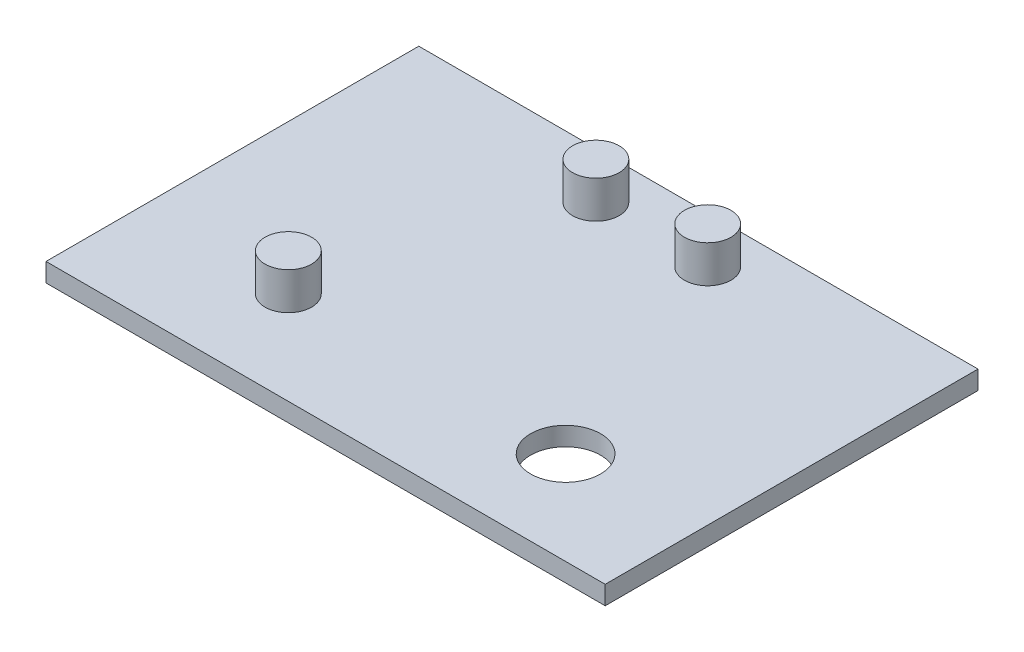
ISO-10303-21;
HEADER;
FILE_DESCRIPTION(('STEP AP214'),'2;1');
FILE_NAME('part.step','',(''),(''),'','','');
FILE_SCHEMA(('AUTOMOTIVE_DESIGN { 1 0 10303 214 1 1 1 1 }'));
ENDSEC;
DATA;
#1=APPLICATION_CONTEXT('core data for automotive mechanical design processes');
#2=APPLICATION_PROTOCOL_DEFINITION('international standard','automotive_design',2000,#1);
#3=PRODUCT_CONTEXT('',#1,'mechanical');
#4=PRODUCT('Part','Part','',(#3));
#5=PRODUCT_RELATED_PRODUCT_CATEGORY('part','',(#4));
#6=PRODUCT_DEFINITION_FORMATION('','',#4);
#7=PRODUCT_DEFINITION_CONTEXT('part definition',#1,'design');
#8=PRODUCT_DEFINITION('design','',#6,#7);
#9=PRODUCT_DEFINITION_SHAPE('','',#8);
#10=(LENGTH_UNIT() NAMED_UNIT(*) SI_UNIT(.MILLI.,.METRE.));
#11=(NAMED_UNIT(*) PLANE_ANGLE_UNIT() SI_UNIT($,.RADIAN.));
#12=(NAMED_UNIT(*) SI_UNIT($,.STERADIAN.) SOLID_ANGLE_UNIT());
#13=UNCERTAINTY_MEASURE_WITH_UNIT(LENGTH_MEASURE(1.E-05),#10,'distance_accuracy_value','');
#14=(GEOMETRIC_REPRESENTATION_CONTEXT(3) GLOBAL_UNCERTAINTY_ASSIGNED_CONTEXT((#13)) GLOBAL_UNIT_ASSIGNED_CONTEXT((#10,
#11,#12)) REPRESENTATION_CONTEXT('',''));
#15=CARTESIAN_POINT('',(0.,0.,0.));
#16=DIRECTION('',(0.,0.,1.));
#17=DIRECTION('',(1.,0.,0.));
#18=AXIS2_PLACEMENT_3D('',#15,#16,#17);
#19=CARTESIAN_POINT('',(-30.,2.,-10.));
#20=DIRECTION('',(1.,0.,0.));
#21=DIRECTION('',(0.,0.,-1.));
#22=AXIS2_PLACEMENT_3D('',#19,#20,#21);
#23=PLANE('',#22);
#24=DIRECTION('',(0.,0.,1.));
#25=VECTOR('',#24,1.);
#26=CARTESIAN_POINT('',(-30.,0.,-10.));
#27=LINE('',#26,#25);
#28=CARTESIAN_POINT('',(-30.,0.,-30.));
#29=VERTEX_POINT('',#28);
#30=CARTESIAN_POINT('',(-30.,0.,10.));
#31=VERTEX_POINT('',#30);
#32=EDGE_CURVE('E66',#29,#31,#27,.T.);
#33=ORIENTED_EDGE('',*,*,#32,.T.);
#34=DIRECTION('',(0.,-1.,0.));
#35=VECTOR('',#34,1.);
#36=CARTESIAN_POINT('',(-30.,2.,10.));
#37=LINE('',#36,#35);
#38=CARTESIAN_POINT('',(-30.,2.,10.));
#39=VERTEX_POINT('',#38);
#40=EDGE_CURVE('E11',#39,#31,#37,.T.);
#41=ORIENTED_EDGE('',*,*,#40,.F.);
#42=DIRECTION('',(0.,0.,1.));
#43=VECTOR('',#42,1.);
#44=CARTESIAN_POINT('',(-30.,2.,-10.));
#45=LINE('',#44,#43);
#46=CARTESIAN_POINT('',(-30.,2.,-30.));
#47=VERTEX_POINT('',#46);
#48=EDGE_CURVE('E76',#47,#39,#45,.T.);
#49=ORIENTED_EDGE('',*,*,#48,.F.);
#50=DIRECTION('',(0.,1.,0.));
#51=VECTOR('',#50,1.);
#52=CARTESIAN_POINT('',(-30.,0.,-30.));
#53=LINE('',#52,#51);
#54=EDGE_CURVE('E78',#29,#47,#53,.T.);
#55=ORIENTED_EDGE('',*,*,#54,.F.);
#56=EDGE_LOOP('',(#33,#41,#49,#55));
#57=FACE_BOUND('',#56,.T.);
#58=ADVANCED_FACE('F33',(#57),#23,.F.);
#59=CARTESIAN_POINT('',(-30.,2.,10.));
#60=DIRECTION('',(0.,0.,-1.));
#61=DIRECTION('',(-1.,0.,0.));
#62=AXIS2_PLACEMENT_3D('',#59,#60,#61);
#63=PLANE('',#62);
#64=DIRECTION('',(1.,0.,0.));
#65=VECTOR('',#64,1.);
#66=CARTESIAN_POINT('',(-30.,0.,10.));
#67=LINE('',#66,#65);
#68=CARTESIAN_POINT('',(30.,0.,10.));
#69=VERTEX_POINT('',#68);
#70=EDGE_CURVE('E61',#31,#69,#67,.T.);
#71=ORIENTED_EDGE('',*,*,#70,.T.);
#72=DIRECTION('',(0.,-1.,0.));
#73=VECTOR('',#72,1.);
#74=CARTESIAN_POINT('',(30.,2.,10.));
#75=LINE('',#74,#73);
#76=CARTESIAN_POINT('',(30.,2.,10.));
#77=VERTEX_POINT('',#76);
#78=EDGE_CURVE('E42',#77,#69,#75,.T.);
#79=ORIENTED_EDGE('',*,*,#78,.F.);
#80=DIRECTION('',(1.,0.,0.));
#81=VECTOR('',#80,1.);
#82=CARTESIAN_POINT('',(-30.,2.,10.));
#83=LINE('',#82,#81);
#84=EDGE_CURVE('E50',#39,#77,#83,.T.);
#85=ORIENTED_EDGE('',*,*,#84,.F.);
#86=ORIENTED_EDGE('',*,*,#40,.T.);
#87=EDGE_LOOP('',(#71,#79,#85,#86));
#88=FACE_BOUND('',#87,.T.);
#89=ADVANCED_FACE('F140',(#88),#63,.F.);
#90=CARTESIAN_POINT('',(30.,2.,-10.));
#91=DIRECTION('',(-1.,0.,0.));
#92=DIRECTION('',(0.,0.,1.));
#93=AXIS2_PLACEMENT_3D('',#90,#91,#92);
#94=PLANE('',#93);
#95=DIRECTION('',(0.,0.,-1.));
#96=VECTOR('',#95,1.);
#97=CARTESIAN_POINT('',(30.,0.,-10.));
#98=LINE('',#97,#96);
#99=CARTESIAN_POINT('',(30.,0.,-30.));
#100=VERTEX_POINT('',#99);
#101=EDGE_CURVE('E81',#69,#100,#98,.T.);
#102=ORIENTED_EDGE('',*,*,#101,.T.);
#103=DIRECTION('',(0.,1.,0.));
#104=VECTOR('',#103,1.);
#105=CARTESIAN_POINT('',(30.,0.,-30.));
#106=LINE('',#105,#104);
#107=CARTESIAN_POINT('',(30.,2.,-30.));
#108=VERTEX_POINT('',#107);
#109=EDGE_CURVE('E89',#100,#108,#106,.T.);
#110=ORIENTED_EDGE('',*,*,#109,.T.);
#111=DIRECTION('',(0.,0.,-1.));
#112=VECTOR('',#111,1.);
#113=CARTESIAN_POINT('',(30.,2.,-10.));
#114=LINE('',#113,#112);
#115=EDGE_CURVE('E93',#77,#108,#114,.T.);
#116=ORIENTED_EDGE('',*,*,#115,.F.);
#117=ORIENTED_EDGE('',*,*,#78,.T.);
#118=EDGE_LOOP('',(#102,#110,#116,#117));
#119=FACE_BOUND('',#118,.T.);
#120=ADVANCED_FACE('F120',(#119),#94,.F.);
#121=CARTESIAN_POINT('',(0.,2.,0.));
#122=DIRECTION('',(0.,1.,0.));
#123=DIRECTION('',(0.,0.,1.));
#124=AXIS2_PLACEMENT_3D('',#121,#122,#123);
#125=PLANE('',#124);
#126=CARTESIAN_POINT('',(6.,2.,-25.));
#127=DIRECTION('',(0.,1.,0.));
#128=DIRECTION('',(0.,0.,1.));
#129=AXIS2_PLACEMENT_3D('',#126,#127,#128);
#130=CIRCLE('',#129,2.5);
#131=CARTESIAN_POINT('',(6.,2.,-22.5));
#132=VERTEX_POINT('',#131);
#133=EDGE_CURVE('E266',#132,#132,#130,.T.);
#134=ORIENTED_EDGE('',*,*,#133,.F.);
#135=EDGE_LOOP('',(#134));
#136=FACE_BOUND('',#135,.T.);
#137=CARTESIAN_POINT('',(-6.,2.,-25.));
#138=DIRECTION('',(0.,1.,0.));
#139=DIRECTION('',(0.,0.,1.));
#140=AXIS2_PLACEMENT_3D('',#137,#138,#139);
#141=CIRCLE('',#140,2.5);
#142=CARTESIAN_POINT('',(-6.,2.,-22.5));
#143=VERTEX_POINT('',#142);
#144=EDGE_CURVE('E99',#143,#143,#141,.T.);
#145=ORIENTED_EDGE('',*,*,#144,.F.);
#146=EDGE_LOOP('',(#145));
#147=FACE_BOUND('',#146,.T.);
#148=CARTESIAN_POINT('',(15.75,2.,0.));
#149=DIRECTION('',(0.,1.,0.));
#150=DIRECTION('',(0.,0.,1.));
#151=AXIS2_PLACEMENT_3D('',#148,#149,#150);
#152=CIRCLE('',#151,3.75);
#153=CARTESIAN_POINT('',(15.75,2.,3.75));
#154=VERTEX_POINT('',#153);
#155=EDGE_CURVE('E104',#154,#154,#152,.F.);
#156=ORIENTED_EDGE('',*,*,#155,.T.);
#157=EDGE_LOOP('',(#156));
#158=FACE_BOUND('',#157,.T.);
#159=CARTESIAN_POINT('',(-14.,2.,0.));
#160=DIRECTION('',(0.,1.,0.));
#161=DIRECTION('',(0.,0.,1.));
#162=AXIS2_PLACEMENT_3D('',#159,#160,#161);
#163=CIRCLE('',#162,2.5);
#164=CARTESIAN_POINT('',(-14.,2.,2.5));
#165=VERTEX_POINT('',#164);
#166=EDGE_CURVE('E107',#165,#165,#163,.T.);
#167=ORIENTED_EDGE('',*,*,#166,.F.);
#168=EDGE_LOOP('',(#167));
#169=FACE_BOUND('',#168,.T.);
#170=ORIENTED_EDGE('',*,*,#48,.T.);
#171=ORIENTED_EDGE('',*,*,#84,.T.);
#172=ORIENTED_EDGE('',*,*,#115,.T.);
#173=DIRECTION('',(-1.,0.,0.));
#174=VECTOR('',#173,1.);
#175=CARTESIAN_POINT('',(-30.,2.,-30.));
#176=LINE('',#175,#174);
#177=EDGE_CURVE('E87',#108,#47,#176,.T.);
#178=ORIENTED_EDGE('',*,*,#177,.T.);
#179=EDGE_LOOP('',(#170,#171,#172,#178));
#180=FACE_BOUND('',#179,.T.);
#181=ADVANCED_FACE('F91',(#136,#147,#158,#169,#180),#125,.T.);
#182=CARTESIAN_POINT('',(0.,0.,0.));
#183=DIRECTION('',(0.,1.,0.));
#184=DIRECTION('',(0.,0.,1.));
#185=AXIS2_PLACEMENT_3D('',#182,#183,#184);
#186=PLANE('',#185);
#187=CARTESIAN_POINT('',(15.75,0.,0.));
#188=DIRECTION('',(0.,1.,0.));
#189=DIRECTION('',(0.,0.,1.));
#190=AXIS2_PLACEMENT_3D('',#187,#188,#189);
#191=CIRCLE('',#190,3.75);
#192=CARTESIAN_POINT('',(15.75,0.,3.75));
#193=VERTEX_POINT('',#192);
#194=EDGE_CURVE('E36',#193,#193,#191,.F.);
#195=ORIENTED_EDGE('',*,*,#194,.F.);
#196=EDGE_LOOP('',(#195));
#197=FACE_BOUND('',#196,.T.);
#198=ORIENTED_EDGE('',*,*,#32,.F.);
#199=DIRECTION('',(-1.,0.,0.));
#200=VECTOR('',#199,1.);
#201=CARTESIAN_POINT('',(-30.,0.,-30.));
#202=LINE('',#201,#200);
#203=EDGE_CURVE('E88',#100,#29,#202,.T.);
#204=ORIENTED_EDGE('',*,*,#203,.F.);
#205=ORIENTED_EDGE('',*,*,#101,.F.);
#206=ORIENTED_EDGE('',*,*,#70,.F.);
#207=EDGE_LOOP('',(#198,#204,#205,#206));
#208=FACE_BOUND('',#207,.T.);
#209=ADVANCED_FACE('F122',(#197,#208),#186,.F.);
#210=CARTESIAN_POINT('',(-14.,6.,0.));
#211=DIRECTION('',(0.,-1.,0.));
#212=DIRECTION('',(0.,0.,-1.));
#213=AXIS2_PLACEMENT_3D('',#210,#211,#212);
#214=CYLINDRICAL_SURFACE('',#213,2.5);
#215=CARTESIAN_POINT('',(-14.,6.,0.));
#216=DIRECTION('',(0.,1.,0.));
#217=DIRECTION('',(0.,0.,1.));
#218=AXIS2_PLACEMENT_3D('',#215,#216,#217);
#219=CIRCLE('',#218,2.5);
#220=CARTESIAN_POINT('',(-14.,6.,2.5));
#221=VERTEX_POINT('',#220);
#222=EDGE_CURVE('E108',#221,#221,#219,.T.);
#223=ORIENTED_EDGE('',*,*,#222,.F.);
#224=EDGE_LOOP('',(#223));
#225=FACE_BOUND('',#224,.T.);
#226=ORIENTED_EDGE('',*,*,#166,.T.);
#227=EDGE_LOOP('',(#226));
#228=FACE_BOUND('',#227,.T.);
#229=ADVANCED_FACE('F124',(#225,#228),#214,.T.);
#230=CARTESIAN_POINT('',(-14.,6.,0.));
#231=DIRECTION('',(0.,1.,0.));
#232=DIRECTION('',(0.,0.,1.));
#233=AXIS2_PLACEMENT_3D('',#230,#231,#232);
#234=PLANE('',#233);
#235=ORIENTED_EDGE('',*,*,#222,.T.);
#236=EDGE_LOOP('',(#235));
#237=FACE_BOUND('',#236,.T.);
#238=ADVANCED_FACE('F131',(#237),#234,.T.);
#239=CARTESIAN_POINT('',(15.75,12.,0.));
#240=DIRECTION('',(0.,-1.,0.));
#241=DIRECTION('',(0.,0.,-1.));
#242=AXIS2_PLACEMENT_3D('',#239,#240,#241);
#243=CYLINDRICAL_SURFACE('',#242,3.75);
#244=ORIENTED_EDGE('',*,*,#155,.F.);
#245=EDGE_LOOP('',(#244));
#246=FACE_BOUND('',#245,.T.);
#247=ORIENTED_EDGE('',*,*,#194,.T.);
#248=EDGE_LOOP('',(#247));
#249=FACE_BOUND('',#248,.T.);
#250=ADVANCED_FACE('F205',(#246,#249),#243,.F.);
#251=CARTESIAN_POINT('',(-30.,0.,-30.));
#252=DIRECTION('',(0.,0.,-1.));
#253=DIRECTION('',(-1.,0.,0.));
#254=AXIS2_PLACEMENT_3D('',#251,#252,#253);
#255=PLANE('',#254);
#256=ORIENTED_EDGE('',*,*,#177,.F.);
#257=ORIENTED_EDGE('',*,*,#109,.F.);
#258=ORIENTED_EDGE('',*,*,#203,.T.);
#259=ORIENTED_EDGE('',*,*,#54,.T.);
#260=EDGE_LOOP('',(#256,#257,#258,#259));
#261=FACE_BOUND('',#260,.T.);
#262=ADVANCED_FACE('F85',(#261),#255,.T.);
#263=CARTESIAN_POINT('',(-6.,6.,-25.));
#264=DIRECTION('',(0.,-1.,0.));
#265=DIRECTION('',(0.,0.,-1.));
#266=AXIS2_PLACEMENT_3D('',#263,#264,#265);
#267=CYLINDRICAL_SURFACE('',#266,2.5);
#268=CARTESIAN_POINT('',(-6.,6.,-25.));
#269=DIRECTION('',(0.,1.,0.));
#270=DIRECTION('',(0.,0.,1.));
#271=AXIS2_PLACEMENT_3D('',#268,#269,#270);
#272=CIRCLE('',#271,2.5);
#273=CARTESIAN_POINT('',(-6.,6.,-22.5));
#274=VERTEX_POINT('',#273);
#275=EDGE_CURVE('E95',#274,#274,#272,.T.);
#276=ORIENTED_EDGE('',*,*,#275,.F.);
#277=EDGE_LOOP('',(#276));
#278=FACE_BOUND('',#277,.T.);
#279=ORIENTED_EDGE('',*,*,#144,.T.);
#280=EDGE_LOOP('',(#279));
#281=FACE_BOUND('',#280,.T.);
#282=ADVANCED_FACE('F163',(#278,#281),#267,.T.);
#283=CARTESIAN_POINT('',(-6.,6.,-25.));
#284=DIRECTION('',(0.,1.,0.));
#285=DIRECTION('',(0.,0.,1.));
#286=AXIS2_PLACEMENT_3D('',#283,#284,#285);
#287=PLANE('',#286);
#288=ORIENTED_EDGE('',*,*,#275,.T.);
#289=EDGE_LOOP('',(#288));
#290=FACE_BOUND('',#289,.T.);
#291=ADVANCED_FACE('F168',(#290),#287,.T.);
#292=CARTESIAN_POINT('',(6.,6.,-25.));
#293=DIRECTION('',(0.,-1.,0.));
#294=DIRECTION('',(0.,0.,-1.));
#295=AXIS2_PLACEMENT_3D('',#292,#293,#294);
#296=CYLINDRICAL_SURFACE('',#295,2.5);
#297=CARTESIAN_POINT('',(6.,6.,-25.));
#298=DIRECTION('',(0.,1.,0.));
#299=DIRECTION('',(0.,0.,1.));
#300=AXIS2_PLACEMENT_3D('',#297,#298,#299);
#301=CIRCLE('',#300,2.5);
#302=CARTESIAN_POINT('',(6.,6.,-22.5));
#303=VERTEX_POINT('',#302);
#304=EDGE_CURVE('E265',#303,#303,#301,.T.);
#305=ORIENTED_EDGE('',*,*,#304,.F.);
#306=EDGE_LOOP('',(#305));
#307=FACE_BOUND('',#306,.T.);
#308=ORIENTED_EDGE('',*,*,#133,.T.);
#309=EDGE_LOOP('',(#308));
#310=FACE_BOUND('',#309,.T.);
#311=ADVANCED_FACE('F178',(#307,#310),#296,.T.);
#312=CARTESIAN_POINT('',(6.,6.,-25.));
#313=DIRECTION('',(0.,1.,0.));
#314=DIRECTION('',(0.,0.,1.));
#315=AXIS2_PLACEMENT_3D('',#312,#313,#314);
#316=PLANE('',#315);
#317=ORIENTED_EDGE('',*,*,#304,.T.);
#318=EDGE_LOOP('',(#317));
#319=FACE_BOUND('',#318,.T.);
#320=ADVANCED_FACE('F188',(#319),#316,.T.);
#321=CLOSED_SHELL('',(#58,#89,#120,#181,#209,#229,#238,#250,#262,#282,#291,#311,#320));
#322=MANIFOLD_SOLID_BREP('B2',#321);
#323=ADVANCED_BREP_SHAPE_REPRESENTATION('',(#18,#322),#14);
#324=SHAPE_DEFINITION_REPRESENTATION(#9,#323);
ENDSEC;
END-ISO-10303-21;
